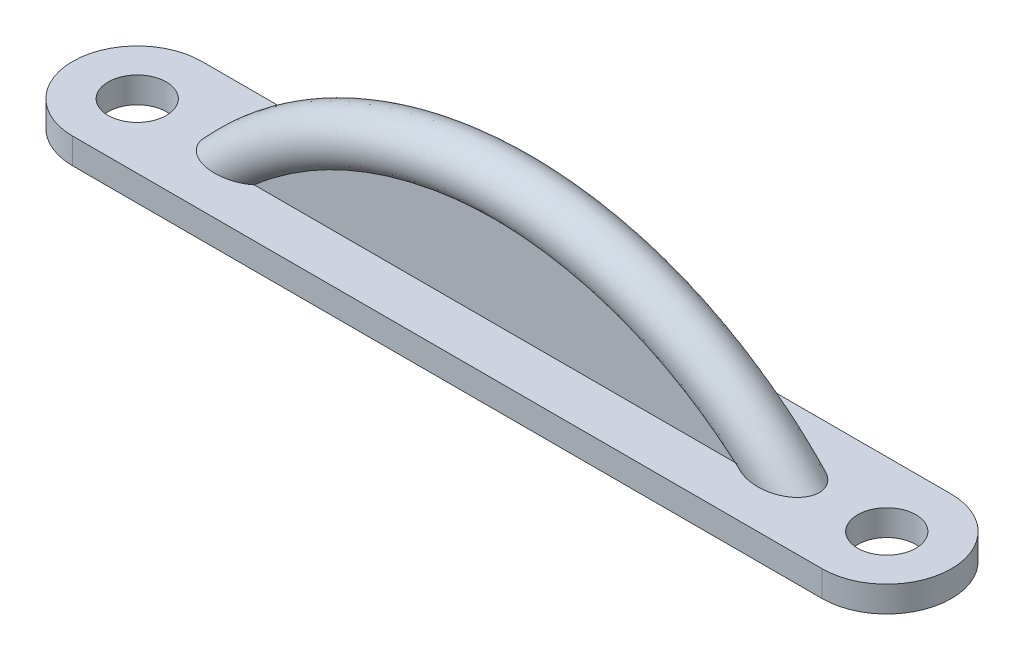
ISO-10303-21;
HEADER;
FILE_DESCRIPTION(('STEP AP214'),'2;1');
FILE_NAME('part.step','',(''),(''),'','','');
FILE_SCHEMA(('AUTOMOTIVE_DESIGN { 1 0 10303 214 1 1 1 1 }'));
ENDSEC;
DATA;
#1=APPLICATION_CONTEXT('core data for automotive mechanical design processes');
#2=APPLICATION_PROTOCOL_DEFINITION('international standard','automotive_design',2000,#1);
#3=PRODUCT_CONTEXT('',#1,'mechanical');
#4=PRODUCT('Part','Part','',(#3));
#5=PRODUCT_RELATED_PRODUCT_CATEGORY('part','',(#4));
#6=PRODUCT_DEFINITION_FORMATION('','',#4);
#7=PRODUCT_DEFINITION_CONTEXT('part definition',#1,'design');
#8=PRODUCT_DEFINITION('design','',#6,#7);
#9=PRODUCT_DEFINITION_SHAPE('','',#8);
#10=(LENGTH_UNIT() NAMED_UNIT(*) SI_UNIT(.MILLI.,.METRE.));
#11=(NAMED_UNIT(*) PLANE_ANGLE_UNIT() SI_UNIT($,.RADIAN.));
#12=(NAMED_UNIT(*) SI_UNIT($,.STERADIAN.) SOLID_ANGLE_UNIT());
#13=UNCERTAINTY_MEASURE_WITH_UNIT(LENGTH_MEASURE(1.E-05),#10,'distance_accuracy_value','');
#14=(GEOMETRIC_REPRESENTATION_CONTEXT(3) GLOBAL_UNCERTAINTY_ASSIGNED_CONTEXT((#13)) GLOBAL_UNIT_ASSIGNED_CONTEXT((#10,
#11,#12)) REPRESENTATION_CONTEXT('',''));
#15=CARTESIAN_POINT('',(0.,0.,0.));
#16=DIRECTION('',(0.,0.,1.));
#17=DIRECTION('',(1.,0.,0.));
#18=AXIS2_PLACEMENT_3D('',#15,#16,#17);
#19=CARTESIAN_POINT('',(-29.,2.,0.));
#20=DIRECTION('',(0.,1.,0.));
#21=DIRECTION('',(0.,0.,1.));
#22=AXIS2_PLACEMENT_3D('',#19,#20,#21);
#23=PLANE('',#22);
#24=CARTESIAN_POINT('',(-29.,2.,0.));
#25=DIRECTION('',(0.,1.,0.));
#26=DIRECTION('',(0.,0.,1.));
#27=AXIS2_PLACEMENT_3D('',#24,#25,#26);
#28=CIRCLE('',#27,2.25);
#29=CARTESIAN_POINT('',(-29.,2.,2.25));
#30=VERTEX_POINT('',#29);
#31=EDGE_CURVE('E285',#30,#30,#28,.T.);
#32=ORIENTED_EDGE('',*,*,#31,.F.);
#33=EDGE_LOOP('',(#32));
#34=FACE_BOUND('',#33,.T.);
#35=CARTESIAN_POINT('',(29.,2.,0.));
#36=DIRECTION('',(0.,1.,0.));
#37=DIRECTION('',(0.,0.,1.));
#38=AXIS2_PLACEMENT_3D('',#35,#36,#37);
#39=CIRCLE('',#38,2.25);
#40=CARTESIAN_POINT('',(29.,2.,2.25));
#41=VERTEX_POINT('',#40);
#42=EDGE_CURVE('E109',#41,#41,#39,.T.);
#43=ORIENTED_EDGE('',*,*,#42,.F.);
#44=EDGE_LOOP('',(#43));
#45=FACE_BOUND('',#44,.T.);
#46=CARTESIAN_POINT('',(18.0234534225179,2.00000000000277,0.));
#47=CARTESIAN_POINT('',(18.0234538199134,2.00000000000342,-0.0425345744357043));
#48=CARTESIAN_POINT('',(18.0255726664473,2.00000000000092,-0.0850784285935698));
#49=CARTESIAN_POINT('',(18.0339906258094,1.99999999999908,-0.169770793580517));
#50=CARTESIAN_POINT('',(18.0402924979108,1.99999999999975,-0.211919024818991));
#51=CARTESIAN_POINT('',(18.0569256716577,2.00000000000025,-0.295503517620379));
#52=CARTESIAN_POINT('',(18.0672653921568,2.00000000000007,-0.336938101538779));
#53=CARTESIAN_POINT('',(18.0917113728627,1.99999999999993,-0.418688955192903));
#54=CARTESIAN_POINT('',(18.1058196466542,1.99999999999998,-0.459004614323405));
#55=CARTESIAN_POINT('',(18.1530063055635,2.00000000000005,-0.577040430029253));
#56=CARTESIAN_POINT('',(18.1911430667857,2.00000000000001,-0.652780639690127));
#57=CARTESIAN_POINT('',(18.2782511712429,1.99999999999999,-0.797563509596352));
#58=CARTESIAN_POINT('',(18.3272237543727,2.,-0.866605402081661));
#59=CARTESIAN_POINT('',(18.4612958971004,2.00000000000001,-1.03191066501507));
#60=CARTESIAN_POINT('',(18.5519426221952,2.,-1.12367029072002));
#61=CARTESIAN_POINT('',(18.7465003988128,2.,-1.29194137668281));
#62=CARTESIAN_POINT('',(18.8504476639748,2.,-1.36840968926873));
#63=CARTESIAN_POINT('',(19.0387273677813,2.,-1.48881743004033));
#64=CARTESIAN_POINT('',(19.1210141621722,2.,-1.53601954595866));
#65=CARTESIAN_POINT('',(19.2893733434549,2.,-1.62314656458356));
#66=CARTESIAN_POINT('',(19.3754474682774,2.,-1.66306808221428));
#67=CARTESIAN_POINT('',(19.6379960210728,2.,-1.77243815298984));
#68=CARTESIAN_POINT('',(19.8188578762378,2.,-1.83152993013925));
#69=CARTESIAN_POINT('',(20.1932017543042,2.,-1.92518670469083));
#70=CARTESIAN_POINT('',(20.3869038432035,2.,-1.95884382487772));
#71=CARTESIAN_POINT('',(20.7773881986897,2.,-1.99860621352698));
#72=CARTESIAN_POINT('',(20.9741731909739,2.,-2.00468553840482));
#73=CARTESIAN_POINT('',(21.2860910339309,2.,-1.99155346967884));
#74=CARTESIAN_POINT('',(21.4016674073519,2.,-1.98167767553965));
#75=CARTESIAN_POINT('',(21.6314567483007,2.,-1.95155592896872));
#76=CARTESIAN_POINT('',(21.7456692507373,2.00000000000001,-1.93130653688359));
#77=CARTESIAN_POINT('',(22.0842626541814,1.99999999999999,-1.85433459676142));
#78=CARTESIAN_POINT('',(22.3054474382207,1.99999999999993,-1.78136027129505));
#79=CARTESIAN_POINT('',(22.6379071638108,1.99999999999997,-1.62796277123609));
#80=CARTESIAN_POINT('',(22.7565937829384,2.00000000000001,-1.56329771166025));
#81=CARTESIAN_POINT('',(22.9827617946772,1.99999999999999,-1.4165973984217));
#82=CARTESIAN_POINT('',(23.0902607022528,1.99999999999992,-1.33458992474679));
#83=CARTESIAN_POINT('',(23.2680573302236,1.99999999999996,-1.17183450653481));
#84=CARTESIAN_POINT('',(23.3414239460572,2.00000000000003,-1.09444962203087));
#85=CARTESIAN_POINT('',(23.4747243469283,1.99999999999997,-0.928808686808913));
#86=CARTESIAN_POINT('',(23.5346736726764,1.99999999999982,-0.840565398559824));
#87=CARTESIAN_POINT('',(23.6286931367383,1.99999999999986,-0.670337381196437));
#88=CARTESIAN_POINT('',(23.6654282246682,1.99999999999998,-0.589830433261606));
#89=CARTESIAN_POINT('',(23.7249674386916,2.00000000000002,-0.423796887658625));
#90=CARTESIAN_POINT('',(23.7477800836642,1.99999999999992,-0.338273394708835));
#91=CARTESIAN_POINT('',(23.7779673328133,1.9999999999999,-0.164144303664863));
#92=CARTESIAN_POINT('',(23.7852780856585,1.99999999999997,-0.0755274804102099));
#93=CARTESIAN_POINT('',(23.7836992808108,2.00000000000003,0.10156109306596));
#94=CARTESIAN_POINT('',(23.7748104972629,2.00000000000001,0.190032850017695));
#95=CARTESIAN_POINT('',(23.7426472671903,1.99999999999999,0.358143219232906));
#96=CARTESIAN_POINT('',(23.7203721591455,2.,0.437977349713582));
#97=CARTESIAN_POINT('',(23.66367999972,2.,0.593173729893854));
#98=CARTESIAN_POINT('',(23.6292608469502,2.,0.668535203012611));
#99=CARTESIAN_POINT('',(23.5469331921194,2.,0.819133588514863));
#100=CARTESIAN_POINT('',(23.4981865298646,2.,0.893908980652055));
#101=CARTESIAN_POINT('',(23.3908259572644,2.,1.03595902011016));
#102=CARTESIAN_POINT('',(23.3322059357408,2.,1.10322897876135));
#103=CARTESIAN_POINT('',(23.1735720734291,2.,1.2639167951135));
#104=CARTESIAN_POINT('',(23.0681953534476,2.,1.35206020117909));
#105=CARTESIAN_POINT('',(22.8446298735978,2.,1.51031305841495));
#106=CARTESIAN_POINT('',(22.7264103017644,2.,1.58037771472353));
#107=CARTESIAN_POINT('',(22.438408719279,2.,1.72495809186434));
#108=CARTESIAN_POINT('',(22.2650868682979,2.,1.79241292068604));
#109=CARTESIAN_POINT('',(21.9100821449645,2.,1.89861374792659));
#110=CARTESIAN_POINT('',(21.7283952095455,2.,1.93734563548875));
#111=CARTESIAN_POINT('',(21.3572490743215,2.,1.98881852581633));
#112=CARTESIAN_POINT('',(21.1677071026586,2.,2.00094747737747));
#113=CARTESIAN_POINT('',(20.7885388152836,2.,1.9989353352007));
#114=CARTESIAN_POINT('',(20.5989126669986,2.,1.98476300698581));
#115=CARTESIAN_POINT('',(20.2982958696304,2.,1.94145571689516));
#116=CARTESIAN_POINT('',(20.1860607294702,2.,1.92052624132336));
#117=CARTESIAN_POINT('',(19.9636950601378,2.,1.86923156783867));
#118=CARTESIAN_POINT('',(19.8535652935132,2.00000000000001,1.83886301742037));
#119=CARTESIAN_POINT('',(19.6366015603487,1.99999999999999,1.7684987406309));
#120=CARTESIAN_POINT('',(19.5297626570463,1.99999999999996,1.72851831528071));
#121=CARTESIAN_POINT('',(19.3204783172365,2.00000000000004,1.63849276505416));
#122=CARTESIAN_POINT('',(19.2180295546273,2.00000000000013,1.58845542921118));
#123=CARTESIAN_POINT('',(19.0071595582886,2.00000000000012,1.47104355371215));
#124=CARTESIAN_POINT('',(18.8994823366105,1.99999999999999,1.40231330184445));
#125=CARTESIAN_POINT('',(18.6949076605889,2.00000000000001,1.25033517629734));
#126=CARTESIAN_POINT('',(18.5979934960938,2.00000000000016,1.16711033713112));
#127=CARTESIAN_POINT('',(18.4406962094944,2.00000000000009,1.00638866409387));
#128=CARTESIAN_POINT('',(18.3770668597997,1.99999999999994,0.932091158487234));
#129=CARTESIAN_POINT('',(18.2622969059184,2.00000000000006,0.774305507604812));
#130=CARTESIAN_POINT('',(18.2111422773693,2.00000000000032,0.690827837564686));
#131=CARTESIAN_POINT('',(18.1341827219841,2.00000000000014,0.533921688363925));
#132=CARTESIAN_POINT('',(18.1053209862241,1.99999999999984,0.461997906170942));
#133=CARTESIAN_POINT('',(18.0599637341643,2.00000000000016,0.314425206498432));
#134=CARTESIAN_POINT('',(18.0434349275885,2.00000000000077,0.238786908908229));
#135=CARTESIAN_POINT('',(18.0303178008871,1.99999999999978,0.135455419222586));
#136=CARTESIAN_POINT('',(18.027748020089,1.99999999999936,0.108436381797406));
#137=CARTESIAN_POINT('',(18.0243155087062,2.00000000000064,0.0542795062745339));
#138=CARTESIAN_POINT('',(18.0234531689366,2.00000000000235,0.0271416424029775));
#139=CARTESIAN_POINT('',(18.0234534225179,2.00000000000277,0.));
#140=B_SPLINE_CURVE_WITH_KNOTS('',3,(#46,#47,#48,#49,#50,#51,#52,#53,#54,#55,#56,#57,#58,#59,
#60,#61,#62,#63,#64,#65,#66,#67,#68,#69,#70,#71,#72,#73,#74,#75,#76,#77,#78,#79,#80,#81,#82,#83,
#84,#85,#86,#87,#88,#89,#90,#91,#92,#93,#94,#95,#96,#97,#98,#99,#100,#101,#102,#103,#104,#105,
#106,#107,#108,#109,#110,#111,#112,#113,#114,#115,#116,#117,#118,#119,#120,#121,#122,#123,#124,
#125,#126,#127,#128,#129,#130,#131,#132,#133,#134,#135,#136,#137,#138,#139),.UNSPECIFIED.,.T.,
.F.,(4,2,2,2,2,2,2,2,2,2,2,2,2,2,2,2,2,2,2,2,2,2,2,2,2,2,2,2,2,2,2,2,2,2,2,2,2,2,2,2,2,2,2,2,2,
2,4),(0.,0.127567624481767,0.255219480863997,0.383138922799489,0.511126850873842,
0.764287783105275,1.01747769840513,1.40226947598606,1.78813216182818,2.07235450967611,
2.35670867017019,2.92520377319501,3.51314031908931,4.10162984691655,4.44917655235614,
4.79683857118095,5.48965210767889,5.89394283190812,6.29759078220387,6.61633858423133,
6.93471526047495,7.19908195722368,7.4632867303926,7.72857764946236,7.99385589111793,
8.24143548217484,8.48905793510012,8.75585490642479,9.02281762439544,9.43265916643228,
9.84350665328771,10.3984805780657,10.9537269672464,11.5216194640115,12.0901868015828,
12.4323472615216,12.7746293867864,13.1163702039186,13.4578473571822,13.840033639508,
14.2216180104772,14.5141115050392,14.8062746400255,15.0378654093194,15.26882876139,
15.3502120280427,15.4316139203107),.UNSPECIFIED.);
#141=CARTESIAN_POINT('',(18.6993506458462,2.,-1.25));
#142=VERTEX_POINT('',#141);
#143=CARTESIAN_POINT('',(18.6993506458465,2.,1.25));
#144=VERTEX_POINT('',#143);
#145=EDGE_CURVE('E61',#142,#144,#140,.T.);
#146=ORIENTED_EDGE('',*,*,#145,.T.);
#147=DIRECTION('',(1.,0.,0.));
#148=VECTOR('',#147,1.);
#149=CARTESIAN_POINT('',(-21.,2.,1.25));
#150=LINE('',#149,#148);
#151=CARTESIAN_POINT('',(-18.7011756852005,2.,1.25));
#152=VERTEX_POINT('',#151);
#153=EDGE_CURVE('E101',#152,#144,#150,.T.);
#154=ORIENTED_EDGE('',*,*,#153,.F.);
#155=CARTESIAN_POINT('',(-18.0277425041409,2.00000000000407,0.));
#156=CARTESIAN_POINT('',(-18.0277433267402,2.00000000000503,0.0426304807114197));
#157=CARTESIAN_POINT('',(-18.029867568113,2.00000000000138,0.0852718774203251));
#158=CARTESIAN_POINT('',(-18.0382968685185,1.99999999999862,0.170148620515763));
#159=CARTESIAN_POINT('',(-18.0446046892751,1.99999999999952,0.212383679968232));
#160=CARTESIAN_POINT('',(-18.0696189165222,2.00000000000096,0.338051665365508));
#161=CARTESIAN_POINT('',(-18.0944154887685,2.00000000000026,0.420335957496417));
#162=CARTESIAN_POINT('',(-18.1575554655815,1.99999999999975,0.578416179111028));
#163=CARTESIAN_POINT('',(-18.1957652108823,1.99999999999993,0.654267276338257));
#164=CARTESIAN_POINT('',(-18.2830403792727,2.00000000000007,0.799342034731207));
#165=CARTESIAN_POINT('',(-18.3321074270897,2.00000000000002,0.868564701770307));
#166=CARTESIAN_POINT('',(-18.4664940798311,1.99999999999997,1.03440733851958));
#167=CARTESIAN_POINT('',(-18.5573791366837,1.99999999999999,1.12650144761394));
#168=CARTESIAN_POINT('',(-18.7524730627675,2.00000000000001,1.29539972604479));
#169=CARTESIAN_POINT('',(-18.8567179157446,2.,1.37216111391577));
#170=CARTESIAN_POINT('',(-19.0449120845398,2.,1.49255898715114));
#171=CARTESIAN_POINT('',(-19.1267595463599,2.,1.53954739552426));
#172=CARTESIAN_POINT('',(-19.2942226035015,2.,1.626286277862));
#173=CARTESIAN_POINT('',(-19.3798398733656,2.,1.66603349419358));
#174=CARTESIAN_POINT('',(-19.6410034028457,2.,1.77489389267317));
#175=CARTESIAN_POINT('',(-19.8209335576226,2.,1.83367033384812));
#176=CARTESIAN_POINT('',(-20.1929920374768,2.,1.92654103855913));
#177=CARTESIAN_POINT('',(-20.3853265113177,2.,1.95978290783329));
#178=CARTESIAN_POINT('',(-20.7730221402183,2.,1.99884838398918));
#179=CARTESIAN_POINT('',(-20.9683859815674,2.,2.00464607326431));
#180=CARTESIAN_POINT('',(-21.2778689776049,2.,1.99138855182802));
#181=CARTESIAN_POINT('',(-21.3924364491539,2.,1.98155386764491));
#182=CARTESIAN_POINT('',(-21.6202390061627,2.,1.95173211339625));
#183=CARTESIAN_POINT('',(-21.733473651031,2.,1.93174177755982));
#184=CARTESIAN_POINT('',(-22.0692745939804,1.99999999999999,1.85592029707505));
#185=CARTESIAN_POINT('',(-22.2887299505465,1.99999999999995,1.78421142763586));
#186=CARTESIAN_POINT('',(-22.6208679362097,1.99999999999998,1.63288714582956));
#187=CARTESIAN_POINT('',(-22.7405862383429,2.00000000000002,1.56843104164335));
#188=CARTESIAN_POINT('',(-22.9688535216847,1.99999999999998,1.42201306445452));
#189=CARTESIAN_POINT('',(-23.0774201698161,1.99999999999992,1.34007953400892));
#190=CARTESIAN_POINT('',(-23.2568282480644,1.99999999999996,1.17753649401329));
#191=CARTESIAN_POINT('',(-23.3307779334852,2.00000000000003,1.10036872043215));
#192=CARTESIAN_POINT('',(-23.4652929374566,1.99999999999997,0.935078274680216));
#193=CARTESIAN_POINT('',(-23.5258738530281,1.99999999999982,0.846968557862327));
#194=CARTESIAN_POINT('',(-23.6209384776743,1.99999999999986,0.677080792381228));
#195=CARTESIAN_POINT('',(-23.6581180318881,1.99999999999998,0.5968173821485));
#196=CARTESIAN_POINT('',(-23.7185901969337,2.00000000000002,0.431195286648227));
#197=CARTESIAN_POINT('',(-23.7418913986298,1.99999999999992,0.34583978952208));
#198=CARTESIAN_POINT('',(-23.7730662989836,1.9999999999999,0.171942950659065));
#199=CARTESIAN_POINT('',(-23.7808740097531,1.99999999999997,0.0833896107970098));
#200=CARTESIAN_POINT('',(-23.7802481301029,2.00000000000003,-0.0936591727292396));
#201=CARTESIAN_POINT('',(-23.7718155784341,2.00000000000001,-0.182154619734182));
#202=CARTESIAN_POINT('',(-23.7405058405214,1.99999999999999,-0.350168648386967));
#203=CARTESIAN_POINT('',(-23.7186663770895,2.,-0.429885120973572));
#204=CARTESIAN_POINT('',(-23.6628370338867,2.,-0.584906057606654));
#205=CARTESIAN_POINT('',(-23.6288450758422,2.,-0.660209764433259));
#206=CARTESIAN_POINT('',(-23.5474596044956,2.,-0.810609079094444));
#207=CARTESIAN_POINT('',(-23.4992468816128,2.,-0.885258105981369));
#208=CARTESIAN_POINT('',(-23.3929661843915,2.,-1.02712973292367));
#209=CARTESIAN_POINT('',(-23.3348921653977,2.,-1.09434773602593));
#210=CARTESIAN_POINT('',(-23.1775101750125,2.,-1.25513854749218));
#211=CARTESIAN_POINT('',(-23.0728161715048,2.,-1.34345894301076));
#212=CARTESIAN_POINT('',(-22.8505861706031,2.,-1.50218450389608));
#213=CARTESIAN_POINT('',(-22.7330190883365,2.,-1.57254487404));
#214=CARTESIAN_POINT('',(-22.4459329907299,2.,-1.71827006853754));
#215=CARTESIAN_POINT('',(-22.2728063144918,2.,-1.78651741322059));
#216=CARTESIAN_POINT('',(-21.9180634284222,2.,-1.89435974466344));
#217=CARTESIAN_POINT('',(-21.7364426296607,2.,-1.93393904869822));
#218=CARTESIAN_POINT('',(-21.3651949089884,2.,-1.98717207417489));
#219=CARTESIAN_POINT('',(-21.1754800764043,2.,-2.00019835741731));
#220=CARTESIAN_POINT('',(-20.7958648576458,2.,-1.99979686715706));
#221=CARTESIAN_POINT('',(-20.6059644921285,2.,-1.98634053510521));
#222=CARTESIAN_POINT('',(-20.3054741259634,2.,-1.94398988240644));
#223=CARTESIAN_POINT('',(-20.1936419387735,2.,-1.92345900082803));
#224=CARTESIAN_POINT('',(-19.9720653200939,2.,-1.87293194694496));
#225=CARTESIAN_POINT('',(-19.8623216234371,2.00000000000001,-1.84293250611783));
#226=CARTESIAN_POINT('',(-19.6461050335743,1.99999999999999,-1.77328364323568));
#227=CARTESIAN_POINT('',(-19.5396275062811,1.99999999999997,-1.73364868025673));
#228=CARTESIAN_POINT('',(-19.3310413418796,2.00000000000003,-1.64432462216939));
#229=CARTESIAN_POINT('',(-19.2289294901987,2.00000000000012,-1.59464308466538));
#230=CARTESIAN_POINT('',(-19.0171709783794,2.00000000000011,-1.47719198297984));
#231=CARTESIAN_POINT('',(-18.9083634932048,1.99999999999999,-1.40788706160692));
#232=CARTESIAN_POINT('',(-18.7017145769267,2.00000000000001,-1.25449857465813));
#233=CARTESIAN_POINT('',(-18.60385591722,2.00000000000017,-1.17043877789447));
#234=CARTESIAN_POINT('',(-18.4456944323596,2.00000000000009,-1.00861589583199));
#235=CARTESIAN_POINT('',(-18.3820129578964,1.99999999999994,-0.93417653376944));
#236=CARTESIAN_POINT('',(-18.267117298885,2.00000000000006,-0.776130005112027));
#237=CARTESIAN_POINT('',(-18.2158888113149,2.00000000000034,-0.692533517731648));
#238=CARTESIAN_POINT('',(-18.138772468303,2.00000000000011,-0.535335852165517));
#239=CARTESIAN_POINT('',(-18.1098361720202,1.99999999999975,-0.46323596145992));
#240=CARTESIAN_POINT('',(-18.0643606762134,2.00000000000025,-0.315301245198184));
#241=CARTESIAN_POINT('',(-18.0477882030441,2.0000000000011,-0.239477033762297));
#242=CARTESIAN_POINT('',(-18.0346310654606,1.99999999999967,-0.135874169374633));
#243=CARTESIAN_POINT('',(-18.0320522857935,1.99999999999905,-0.108771635362323));
#244=CARTESIAN_POINT('',(-18.028607543815,2.00000000000095,-0.054447569112182));
#245=CARTESIAN_POINT('',(-18.0277419787868,2.00000000000345,-0.0272260107397705));
#246=CARTESIAN_POINT('',(-18.0277425041409,2.00000000000407,0.));
#247=B_SPLINE_CURVE_WITH_KNOTS('',3,(#155,#156,#157,#158,#159,#160,#161,#162,#163,#164,#165,
#166,#167,#168,#169,#170,#171,#172,#173,#174,#175,#176,#177,#178,#179,#180,#181,#182,#183,#184,
#185,#186,#187,#188,#189,#190,#191,#192,#193,#194,#195,#196,#197,#198,#199,#200,#201,#202,#203,
#204,#205,#206,#207,#208,#209,#210,#211,#212,#213,#214,#215,#216,#217,#218,#219,#220,#221,#222,
#223,#224,#225,#226,#227,#228,#229,#230,#231,#232,#233,#234,#235,#236,#237,#238,#239,#240,#241,
#242,#243,#244,#245,#246),.UNSPECIFIED.,.T.,.F.,(4,2,2,2,2,2,2,2,2,2,2,2,2,2,2,2,2,2,2,2,2,2,2,
2,2,2,2,2,2,2,2,2,2,2,2,2,2,2,2,2,2,2,2,2,2,4),(0.,0.127853439637583,0.255791363822138,
0.511995872056913,0.765716623298757,1.01947536796808,1.40549904368923,1.79258520504823,
2.07534979606767,2.35824128343098,2.92377289902849,3.50744878853766,4.0916757773386,
4.43621187661649,4.78085883917415,5.46780692830919,5.87451646533126,6.28057140222342,
6.60005795304018,6.91916977254221,7.18343367030706,7.44753381512689,7.71275638762963,
7.97796199667145,8.22485320094927,8.47178664783906,8.73739807655006,9.00317290809905,
9.41179256027598,9.82142163147926,10.3767138825845,10.9323096749099,11.5008885572018,
12.0700809244328,12.4108315825422,12.7516999957942,13.0920600250474,13.4321649622868,
13.8181056436392,14.2034302205704,14.4963551336965,14.7889419977992,15.0211027985215,
15.2526365293406,15.3342713628601,15.4159251247366),.UNSPECIFIED.);
#248=CARTESIAN_POINT('',(-18.7011756852007,2.,-1.25000000000019));
#249=VERTEX_POINT('',#248);
#250=EDGE_CURVE('E104',#152,#249,#247,.T.);
#251=ORIENTED_EDGE('',*,*,#250,.T.);
#252=DIRECTION('',(1.,0.,0.));
#253=VECTOR('',#252,1.);
#254=CARTESIAN_POINT('',(-21.,2.,-1.25));
#255=LINE('',#254,#253);
#256=EDGE_CURVE('E98',#249,#142,#255,.T.);
#257=ORIENTED_EDGE('',*,*,#256,.T.);
#258=EDGE_LOOP('',(#146,#154,#251,#257));
#259=FACE_BOUND('',#258,.T.);
#260=CARTESIAN_POINT('',(-29.,2.,0.));
#261=DIRECTION('',(0.,1.,0.));
#262=DIRECTION('',(0.,0.,1.));
#263=AXIS2_PLACEMENT_3D('',#260,#261,#262);
#264=CIRCLE('',#263,5.);
#265=CARTESIAN_POINT('',(-29.,2.,-5.));
#266=VERTEX_POINT('',#265);
#267=CARTESIAN_POINT('',(-29.,2.,5.));
#268=VERTEX_POINT('',#267);
#269=EDGE_CURVE('E191',#266,#268,#264,.T.);
#270=ORIENTED_EDGE('',*,*,#269,.T.);
#271=DIRECTION('',(1.,0.,0.));
#272=VECTOR('',#271,1.);
#273=CARTESIAN_POINT('',(-29.,2.,5.));
#274=LINE('',#273,#272);
#275=CARTESIAN_POINT('',(29.,2.,5.));
#276=VERTEX_POINT('',#275);
#277=EDGE_CURVE('E204',#268,#276,#274,.T.);
#278=ORIENTED_EDGE('',*,*,#277,.T.);
#279=CARTESIAN_POINT('',(29.,2.,0.));
#280=DIRECTION('',(0.,1.,0.));
#281=DIRECTION('',(0.,0.,1.));
#282=AXIS2_PLACEMENT_3D('',#279,#280,#281);
#283=CIRCLE('',#282,5.);
#284=CARTESIAN_POINT('',(29.,2.,-5.00000000000001));
#285=VERTEX_POINT('',#284);
#286=EDGE_CURVE('E185',#276,#285,#283,.T.);
#287=ORIENTED_EDGE('',*,*,#286,.T.);
#288=DIRECTION('',(-1.,0.,0.));
#289=VECTOR('',#288,1.);
#290=CARTESIAN_POINT('',(-29.,2.,-5.));
#291=LINE('',#290,#289);
#292=EDGE_CURVE('E198',#285,#266,#291,.T.);
#293=ORIENTED_EDGE('',*,*,#292,.T.);
#294=EDGE_LOOP('',(#270,#278,#287,#293));
#295=FACE_BOUND('',#294,.T.);
#296=ADVANCED_FACE('F40',(#34,#45,#259,#295),#23,.T.);
#297=CARTESIAN_POINT('',(-29.,2.,0.));
#298=DIRECTION('',(0.,-1.,0.));
#299=DIRECTION('',(0.,0.,-1.));
#300=AXIS2_PLACEMENT_3D('',#297,#298,#299);
#301=CYLINDRICAL_SURFACE('',#300,5.);
#302=CARTESIAN_POINT('',(-29.,0.,0.));
#303=DIRECTION('',(0.,1.,0.));
#304=DIRECTION('',(0.,0.,1.));
#305=AXIS2_PLACEMENT_3D('',#302,#303,#304);
#306=CIRCLE('',#305,5.);
#307=CARTESIAN_POINT('',(-29.,0.,-5.));
#308=VERTEX_POINT('',#307);
#309=CARTESIAN_POINT('',(-29.,0.,5.));
#310=VERTEX_POINT('',#309);
#311=EDGE_CURVE('E181',#308,#310,#306,.T.);
#312=ORIENTED_EDGE('',*,*,#311,.T.);
#313=DIRECTION('',(0.,-1.,0.));
#314=VECTOR('',#313,1.);
#315=CARTESIAN_POINT('',(-29.,2.,5.));
#316=LINE('',#315,#314);
#317=EDGE_CURVE('E54',#268,#310,#316,.T.);
#318=ORIENTED_EDGE('',*,*,#317,.F.);
#319=ORIENTED_EDGE('',*,*,#269,.F.);
#320=DIRECTION('',(0.,-1.,0.));
#321=VECTOR('',#320,1.);
#322=CARTESIAN_POINT('',(-29.,2.,-5.));
#323=LINE('',#322,#321);
#324=EDGE_CURVE('E195',#266,#308,#323,.T.);
#325=ORIENTED_EDGE('',*,*,#324,.T.);
#326=EDGE_LOOP('',(#312,#318,#319,#325));
#327=FACE_BOUND('',#326,.T.);
#328=ADVANCED_FACE('F42',(#327),#301,.T.);
#329=CARTESIAN_POINT('',(-29.,2.,5.));
#330=DIRECTION('',(0.,0.,-1.));
#331=DIRECTION('',(-1.,0.,0.));
#332=AXIS2_PLACEMENT_3D('',#329,#330,#331);
#333=PLANE('',#332);
#334=DIRECTION('',(1.,0.,0.));
#335=VECTOR('',#334,1.);
#336=CARTESIAN_POINT('',(-29.,0.,5.));
#337=LINE('',#336,#335);
#338=CARTESIAN_POINT('',(29.,0.,5.));
#339=VERTEX_POINT('',#338);
#340=EDGE_CURVE('E171',#310,#339,#337,.T.);
#341=ORIENTED_EDGE('',*,*,#340,.T.);
#342=DIRECTION('',(0.,-1.,0.));
#343=VECTOR('',#342,1.);
#344=CARTESIAN_POINT('',(29.,2.,5.));
#345=LINE('',#344,#343);
#346=EDGE_CURVE('E173',#276,#339,#345,.T.);
#347=ORIENTED_EDGE('',*,*,#346,.F.);
#348=ORIENTED_EDGE('',*,*,#277,.F.);
#349=ORIENTED_EDGE('',*,*,#317,.T.);
#350=EDGE_LOOP('',(#341,#347,#348,#349));
#351=FACE_BOUND('',#350,.T.);
#352=ADVANCED_FACE('F146',(#351),#333,.F.);
#353=CARTESIAN_POINT('',(29.,2.,0.));
#354=DIRECTION('',(0.,-1.,0.));
#355=DIRECTION('',(0.,0.,-1.));
#356=AXIS2_PLACEMENT_3D('',#353,#354,#355);
#357=CYLINDRICAL_SURFACE('',#356,5.);
#358=CARTESIAN_POINT('',(29.,0.,0.));
#359=DIRECTION('',(0.,1.,0.));
#360=DIRECTION('',(0.,0.,1.));
#361=AXIS2_PLACEMENT_3D('',#358,#359,#360);
#362=CIRCLE('',#361,5.);
#363=CARTESIAN_POINT('',(29.,0.,-5.00000000000001));
#364=VERTEX_POINT('',#363);
#365=EDGE_CURVE('E180',#339,#364,#362,.T.);
#366=ORIENTED_EDGE('',*,*,#365,.T.);
#367=DIRECTION('',(0.,-1.,0.));
#368=VECTOR('',#367,1.);
#369=CARTESIAN_POINT('',(29.,2.,-5.00000000000001));
#370=LINE('',#369,#368);
#371=EDGE_CURVE('E186',#285,#364,#370,.T.);
#372=ORIENTED_EDGE('',*,*,#371,.F.);
#373=ORIENTED_EDGE('',*,*,#286,.F.);
#374=ORIENTED_EDGE('',*,*,#346,.T.);
#375=EDGE_LOOP('',(#366,#372,#373,#374));
#376=FACE_BOUND('',#375,.T.);
#377=ADVANCED_FACE('F161',(#376),#357,.T.);
#378=CARTESIAN_POINT('',(-29.,2.,-5.));
#379=DIRECTION('',(0.,0.,1.));
#380=DIRECTION('',(1.,0.,0.));
#381=AXIS2_PLACEMENT_3D('',#378,#379,#380);
#382=PLANE('',#381);
#383=DIRECTION('',(-1.,0.,0.));
#384=VECTOR('',#383,1.);
#385=CARTESIAN_POINT('',(-29.,0.,-5.));
#386=LINE('',#385,#384);
#387=EDGE_CURVE('E189',#364,#308,#386,.T.);
#388=ORIENTED_EDGE('',*,*,#387,.T.);
#389=ORIENTED_EDGE('',*,*,#324,.F.);
#390=ORIENTED_EDGE('',*,*,#292,.F.);
#391=ORIENTED_EDGE('',*,*,#371,.T.);
#392=EDGE_LOOP('',(#388,#389,#390,#391));
#393=FACE_BOUND('',#392,.T.);
#394=ADVANCED_FACE('F157',(#393),#382,.F.);
#395=CARTESIAN_POINT('',(-29.,0.,0.));
#396=DIRECTION('',(0.,1.,0.));
#397=DIRECTION('',(0.,0.,1.));
#398=AXIS2_PLACEMENT_3D('',#395,#396,#397);
#399=PLANE('',#398);
#400=CARTESIAN_POINT('',(-29.,0.,0.));
#401=DIRECTION('',(0.,-1.,0.));
#402=DIRECTION('',(0.,0.,-1.));
#403=AXIS2_PLACEMENT_3D('',#400,#401,#402);
#404=CIRCLE('',#403,2.25);
#405=CARTESIAN_POINT('',(-29.,0.,-2.25));
#406=VERTEX_POINT('',#405);
#407=EDGE_CURVE('E281',#406,#406,#404,.T.);
#408=ORIENTED_EDGE('',*,*,#407,.F.);
#409=EDGE_LOOP('',(#408));
#410=FACE_BOUND('',#409,.T.);
#411=CARTESIAN_POINT('',(29.,0.,0.));
#412=DIRECTION('',(0.,-1.,0.));
#413=DIRECTION('',(0.,0.,-1.));
#414=AXIS2_PLACEMENT_3D('',#411,#412,#413);
#415=CIRCLE('',#414,2.25);
#416=CARTESIAN_POINT('',(29.,0.,-2.25));
#417=VERTEX_POINT('',#416);
#418=EDGE_CURVE('E112',#417,#417,#415,.T.);
#419=ORIENTED_EDGE('',*,*,#418,.F.);
#420=EDGE_LOOP('',(#419));
#421=FACE_BOUND('',#420,.T.);
#422=ORIENTED_EDGE('',*,*,#311,.F.);
#423=ORIENTED_EDGE('',*,*,#387,.F.);
#424=ORIENTED_EDGE('',*,*,#365,.F.);
#425=ORIENTED_EDGE('',*,*,#340,.F.);
#426=EDGE_LOOP('',(#422,#423,#424,#425));
#427=FACE_BOUND('',#426,.T.);
#428=ADVANCED_FACE('F153',(#410,#421,#427),#399,.F.);
#429=CARTESIAN_POINT('',(0.,-19.4242852856285,1.25));
#430=DIRECTION('',(0.,0.,-1.));
#431=DIRECTION('',(-1.,0.,0.));
#432=AXIS2_PLACEMENT_3D('',#429,#430,#431);
#433=PLANE('',#432);
#434=ORIENTED_EDGE('',*,*,#153,.T.);
#435=CARTESIAN_POINT('',(18.6993506458463,2.,1.25));
#436=CARTESIAN_POINT('',(18.4472470062989,2.2192704251941,1.25));
#437=CARTESIAN_POINT('',(18.1912685664582,2.4340359896724,1.25));
#438=CARTESIAN_POINT('',(17.671933701284,2.85443780150827,1.25));
#439=CARTESIAN_POINT('',(17.4085775038286,3.06007433033004,1.25));
#440=CARTESIAN_POINT('',(16.6079324346724,3.66316364515754,1.25));
#441=CARTESIAN_POINT('',(16.0601083151384,4.04676036622545,1.25));
#442=CARTESIAN_POINT('',(14.9178951025139,4.78931037066029,1.25));
#443=CARTESIAN_POINT('',(14.3225256817868,5.14675132162684,1.25));
#444=CARTESIAN_POINT('',(13.1075309286307,5.81786670736757,1.25));
#445=CARTESIAN_POINT('',(12.4879068313414,6.13154336708118,1.25));
#446=CARTESIAN_POINT('',(11.5424424710738,6.56722937780774,1.25));
#447=CARTESIAN_POINT('',(11.2245365631041,6.70668307616581,1.25));
#448=CARTESIAN_POINT('',(10.5837260223797,6.97362939658905,1.25));
#449=CARTESIAN_POINT('',(10.2608214644853,7.10112219758034,1.25));
#450=CARTESIAN_POINT('',(9.6103812226085,7.34368924471611,1.25));
#451=CARTESIAN_POINT('',(9.28284554733026,7.45876351419756,1.25));
#452=CARTESIAN_POINT('',(8.62368632402062,7.67649380584484,1.25));
#453=CARTESIAN_POINT('',(8.29206272035562,7.77914965879937,1.25));
#454=CARTESIAN_POINT('',(7.29203380588493,8.06860348498867,1.25));
#455=CARTESIAN_POINT('',(6.61821152355503,8.23698381880908,1.25));
#456=CARTESIAN_POINT('',(5.26024206869027,8.52482109496453,1.25));
#457=CARTESIAN_POINT('',(4.57609515482663,8.64427926088273,1.25));
#458=CARTESIAN_POINT('',(3.54500436629034,8.78660696243854,1.25));
#459=CARTESIAN_POINT('',(3.20051637969471,8.82790490835935,1.25));
#460=CARTESIAN_POINT('',(2.51027665908131,8.89814686637353,1.25));
#461=CARTESIAN_POINT('',(2.16452496027961,8.92709122011869,1.25));
#462=CARTESIAN_POINT('',(1.47205127907797,8.972526927482,1.25));
#463=CARTESIAN_POINT('',(1.1253289307814,8.98901268494241,1.25));
#464=CARTESIAN_POINT('',(0.431469070333943,9.00936448392554,1.25));
#465=CARTESIAN_POINT('',(0.0843315126105228,9.01322898242075,1.25));
#466=CARTESIAN_POINT('',(-0.61364819543809,9.00813361114785,1.25));
#467=CARTESIAN_POINT('',(-0.964489355174118,8.99903307270222,1.25));
#468=CARTESIAN_POINT('',(-1.66559644737015,8.96750558152318,1.25));
#469=CARTESIAN_POINT('',(-2.01586234339703,8.94507781507626,1.25));
#470=CARTESIAN_POINT('',(-2.7153860062043,8.88673101438331,1.25));
#471=CARTESIAN_POINT('',(-3.06464341040474,8.85080762030742,1.25));
#472=CARTESIAN_POINT('',(-3.7615331663871,8.76582589856458,1.25));
#473=CARTESIAN_POINT('',(-4.10916553252309,8.71676768714212,1.25));
#474=CARTESIAN_POINT('',(-5.14924795315682,8.55016788422672,1.25));
#475=CARTESIAN_POINT('',(-5.83868007288895,8.41321831766354,1.25));
#476=CARTESIAN_POINT('',(-7.20548707246882,8.08939670628894,1.25));
#477=CARTESIAN_POINT('',(-7.88286517655614,7.90253823202389,1.25));
#478=CARTESIAN_POINT('',(-8.9260466710863,7.57362816051057,1.25));
#479=CARTESIAN_POINT('',(-9.29719613538655,7.44829186439299,1.25));
#480=CARTESIAN_POINT('',(-10.0340604054495,7.18267724721086,1.25));
#481=CARTESIAN_POINT('',(-10.3997760500363,7.04240126029224,1.25));
#482=CARTESIAN_POINT('',(-11.124777320045,6.74717840894358,1.25));
#483=CARTESIAN_POINT('',(-11.4840695984823,6.59224791217101,1.25));
#484=CARTESIAN_POINT('',(-12.0179669785496,6.34880934133999,1.25));
#485=CARTESIAN_POINT('',(-12.1951044215902,6.26581668705805,1.25));
#486=CARTESIAN_POINT('',(-12.5476136671825,6.09615190022831,1.25));
#487=CARTESIAN_POINT('',(-12.7229854351401,6.00947969576179,1.25));
#488=CARTESIAN_POINT('',(-13.1578701864373,5.78880909644648,1.25));
#489=CARTESIAN_POINT('',(-13.4162394013091,5.65254510726999,1.25));
#490=CARTESIAN_POINT('',(-13.9284913229863,5.371847566254,1.25));
#491=CARTESIAN_POINT('',(-14.1823738630932,5.22741371170416,1.25));
#492=CARTESIAN_POINT('',(-14.9372522343295,4.78238474755161,1.25));
#493=CARTESIAN_POINT('',(-15.4314391659008,4.47008242516557,1.25));
#494=CARTESIAN_POINT('',(-16.1584522687954,3.97898358616091,1.25));
#495=CARTESIAN_POINT('',(-16.3988192523552,3.81119686191685,1.25));
#496=CARTESIAN_POINT('',(-16.8743186581645,3.46833193988074,1.25));
#497=CARTESIAN_POINT('',(-17.1094511255565,3.29325380500732,1.25));
#498=CARTESIAN_POINT('',(-17.4579744126271,3.02529915366192,1.25));
#499=CARTESIAN_POINT('',(-17.5734382757853,2.93510337206526,1.25));
#500=CARTESIAN_POINT('',(-17.8029560584767,2.75293321414311,1.25));
#501=CARTESIAN_POINT('',(-17.9170099888082,2.66095885145308,1.25));
#502=CARTESIAN_POINT('',(-18.087002491047,2.52166835578773,1.25));
#503=CARTESIAN_POINT('',(-18.1434863044204,2.47501581484158,1.25));
#504=CARTESIAN_POINT('',(-18.2560890510505,2.38127261336733,1.25));
#505=CARTESIAN_POINT('',(-18.3122079857497,2.33418195457298,1.25));
#506=CARTESIAN_POINT('',(-18.4240636478391,2.23954670369858,1.25));
#507=CARTESIAN_POINT('',(-18.4798003689708,2.19200210421586,1.25));
#508=CARTESIAN_POINT('',(-18.5908331691855,2.09640021684512,1.25));
#509=CARTESIAN_POINT('',(-18.6461292438755,2.048342923857,1.25));
#510=CARTESIAN_POINT('',(-18.7011756852005,2.,1.25));
#511=B_SPLINE_CURVE_WITH_KNOTS('',3,(#435,#436,#437,#438,#439,#440,#441,#442,#443,#444,#445,
#446,#447,#448,#449,#450,#451,#452,#453,#454,#455,#456,#457,#458,#459,#460,#461,#462,#463,#464,
#465,#466,#467,#468,#469,#470,#471,#472,#473,#474,#475,#476,#477,#478,#479,#480,#481,#482,#483,
#484,#485,#486,#487,#488,#489,#490,#491,#492,#493,#494,#495,#496,#497,#498,#499,#500,#501,#502,
#503,#504,#505,#506,#507,#508,#509,#510),.UNSPECIFIED.,.F.,.F.,(4,2,2,2,2,2,2,2,2,2,2,2,2,2,2,2,
2,2,2,2,2,2,2,2,2,2,2,2,2,2,2,2,2,2,2,2,2,4),(0.,1.00224289469103,2.004454866982,
4.00904224688725,6.09062015761494,8.17209220409667,9.21333792255417,10.2545680622657,
11.2957962452582,12.3370386142562,14.4186970418449,16.5003034022852,17.5409825252357,
18.5816328652269,19.6227503676132,20.6639951483338,21.7166236915875,22.7693165112292,
23.822349701391,24.8753735724091,26.9820317104169,29.0881176169139,30.2630595283346,
31.4378181378484,32.611279810872,33.1980901142523,33.7849118924284,34.6610464235728,
35.5372134385991,37.2896807318504,38.1689905438864,39.0482927698021,39.4878302032042,
39.9273642682373,40.1471395108108,40.3669138840444,40.5866918474043,40.8064719990785),.UNSPECIFIED.);
#512=EDGE_CURVE('E67',#144,#152,#511,.T.);
#513=ORIENTED_EDGE('',*,*,#512,.T.);
#514=EDGE_LOOP('',(#434,#513));
#515=FACE_BOUND('',#514,.T.);
#516=ADVANCED_FACE('F156',(#515),#433,.F.);
#517=CARTESIAN_POINT('',(0.,-19.4242852856285,-1.25));
#518=DIRECTION('',(0.,0.,-1.));
#519=DIRECTION('',(-1.,0.,0.));
#520=AXIS2_PLACEMENT_3D('',#517,#518,#519);
#521=PLANE('',#520);
#522=CARTESIAN_POINT('',(18.6993506458463,2.,-1.25));
#523=CARTESIAN_POINT('',(18.4472470062989,2.21927042519411,-1.25));
#524=CARTESIAN_POINT('',(18.1912685664582,2.43403598967241,-1.25));
#525=CARTESIAN_POINT('',(17.671933701284,2.85443780150827,-1.25));
#526=CARTESIAN_POINT('',(17.4085775038286,3.06007433033004,-1.25));
#527=CARTESIAN_POINT('',(16.6079324346724,3.66316364515754,-1.25));
#528=CARTESIAN_POINT('',(16.0601083151384,4.04676036622546,-1.25));
#529=CARTESIAN_POINT('',(14.9178951025139,4.78931037066029,-1.25));
#530=CARTESIAN_POINT('',(14.3225256817868,5.14675132162684,-1.25));
#531=CARTESIAN_POINT('',(13.1075309286307,5.81786670736757,-1.25));
#532=CARTESIAN_POINT('',(12.4879068313414,6.13154336708119,-1.25));
#533=CARTESIAN_POINT('',(11.5424424710738,6.56722937780774,-1.25));
#534=CARTESIAN_POINT('',(11.2245365631041,6.70668307616581,-1.25));
#535=CARTESIAN_POINT('',(10.5837260223797,6.97362939658905,-1.25));
#536=CARTESIAN_POINT('',(10.2608214644853,7.10112219758034,-1.25));
#537=CARTESIAN_POINT('',(9.61038122260849,7.34368924471612,-1.25));
#538=CARTESIAN_POINT('',(9.28284554733024,7.45876351419757,-1.25));
#539=CARTESIAN_POINT('',(8.6236863240206,7.67649380584484,-1.25));
#540=CARTESIAN_POINT('',(8.29206272035561,7.77914965879938,-1.25));
#541=CARTESIAN_POINT('',(7.29203380588492,8.06860348498867,-1.25));
#542=CARTESIAN_POINT('',(6.61821152355502,8.23698381880908,-1.25));
#543=CARTESIAN_POINT('',(5.26024206869026,8.52482109496453,-1.25));
#544=CARTESIAN_POINT('',(4.57609515482661,8.64427926088274,-1.25));
#545=CARTESIAN_POINT('',(3.54500436629032,8.78660696243854,-1.25));
#546=CARTESIAN_POINT('',(3.20051637969469,8.82790490835935,-1.25));
#547=CARTESIAN_POINT('',(2.51027665908129,8.89814686637353,-1.25));
#548=CARTESIAN_POINT('',(2.16452496027959,8.9270912201187,-1.25));
#549=CARTESIAN_POINT('',(1.47205127907795,8.972526927482,-1.25));
#550=CARTESIAN_POINT('',(1.12532893078138,8.98901268494241,-1.25));
#551=CARTESIAN_POINT('',(0.431469070333928,9.00936448392554,-1.25));
#552=CARTESIAN_POINT('',(0.0843315126105082,9.01322898242076,-1.25));
#553=CARTESIAN_POINT('',(-0.613648195438105,9.00813361114785,-1.25));
#554=CARTESIAN_POINT('',(-0.964489355174133,8.99903307270222,-1.25));
#555=CARTESIAN_POINT('',(-1.66559644737016,8.96750558152318,-1.25));
#556=CARTESIAN_POINT('',(-2.01586234339704,8.94507781507626,-1.25));
#557=CARTESIAN_POINT('',(-2.71538600620432,8.88673101438331,-1.25));
#558=CARTESIAN_POINT('',(-3.06464341040475,8.85080762030741,-1.25));
#559=CARTESIAN_POINT('',(-3.76153316638712,8.76582589856458,-1.25));
#560=CARTESIAN_POINT('',(-4.10916553252311,8.71676768714211,-1.25));
#561=CARTESIAN_POINT('',(-5.14924795315684,8.55016788422671,-1.25));
#562=CARTESIAN_POINT('',(-5.83868007288898,8.41321831766352,-1.25));
#563=CARTESIAN_POINT('',(-7.20548707246884,8.08939670628892,-1.25));
#564=CARTESIAN_POINT('',(-7.88286517655616,7.90253823202386,-1.25));
#565=CARTESIAN_POINT('',(-8.92604667108631,7.57362816051053,-1.25));
#566=CARTESIAN_POINT('',(-9.29719613538654,7.44829186439295,-1.25));
#567=CARTESIAN_POINT('',(-10.0340604054495,7.18267724721082,-1.25));
#568=CARTESIAN_POINT('',(-10.3997760500363,7.0424012602922,-1.25));
#569=CARTESIAN_POINT('',(-11.124777320045,6.74717840894356,-1.25));
#570=CARTESIAN_POINT('',(-11.4840695984822,6.59224791217099,-1.25));
#571=CARTESIAN_POINT('',(-12.0179669785495,6.34880934133999,-1.25));
#572=CARTESIAN_POINT('',(-12.1951044215902,6.26581668705805,-1.25));
#573=CARTESIAN_POINT('',(-12.5476136671824,6.09615190022831,-1.25));
#574=CARTESIAN_POINT('',(-12.72298543514,6.00947969576181,-1.25));
#575=CARTESIAN_POINT('',(-13.1578701864372,5.78880909644651,-1.25));
#576=CARTESIAN_POINT('',(-13.416239401309,5.65254510727002,-1.25));
#577=CARTESIAN_POINT('',(-13.9284913229863,5.37184756625405,-1.25));
#578=CARTESIAN_POINT('',(-14.1823738630932,5.22741371170421,-1.25));
#579=CARTESIAN_POINT('',(-14.9372522343294,4.78238474755167,-1.25));
#580=CARTESIAN_POINT('',(-15.4314391659008,4.47008242516563,-1.25));
#581=CARTESIAN_POINT('',(-16.1584522687954,3.97898358616096,-1.25));
#582=CARTESIAN_POINT('',(-16.3988192523552,3.8111968619169,-1.25));
#583=CARTESIAN_POINT('',(-16.8743186581645,3.46833193988077,-1.25));
#584=CARTESIAN_POINT('',(-17.1094511255565,3.29325380500734,-1.25));
#585=CARTESIAN_POINT('',(-17.4579744126271,3.02529915366194,-1.25));
#586=CARTESIAN_POINT('',(-17.5734382757853,2.93510337206528,-1.25));
#587=CARTESIAN_POINT('',(-17.8029560584767,2.75293321414313,-1.25));
#588=CARTESIAN_POINT('',(-17.9170099888082,2.66095885145309,-1.25));
#589=CARTESIAN_POINT('',(-18.087002491047,2.52166835578773,-1.25));
#590=CARTESIAN_POINT('',(-18.1434863044204,2.47501581484158,-1.25));
#591=CARTESIAN_POINT('',(-18.2560890510505,2.38127261336733,-1.25));
#592=CARTESIAN_POINT('',(-18.3122079857497,2.33418195457298,-1.25));
#593=CARTESIAN_POINT('',(-18.4240636478391,2.23954670369857,-1.25));
#594=CARTESIAN_POINT('',(-18.4798003689708,2.19200210421586,-1.25));
#595=CARTESIAN_POINT('',(-18.5908331691855,2.09640021684511,-1.25));
#596=CARTESIAN_POINT('',(-18.6461292438755,2.04834292385699,-1.25));
#597=CARTESIAN_POINT('',(-18.7011756852005,2.,-1.25));
#598=B_SPLINE_CURVE_WITH_KNOTS('',3,(#522,#523,#524,#525,#526,#527,#528,#529,#530,#531,#532,
#533,#534,#535,#536,#537,#538,#539,#540,#541,#542,#543,#544,#545,#546,#547,#548,#549,#550,#551,
#552,#553,#554,#555,#556,#557,#558,#559,#560,#561,#562,#563,#564,#565,#566,#567,#568,#569,#570,
#571,#572,#573,#574,#575,#576,#577,#578,#579,#580,#581,#582,#583,#584,#585,#586,#587,#588,#589,
#590,#591,#592,#593,#594,#595,#596,#597),.UNSPECIFIED.,.F.,.F.,(4,2,2,2,2,2,2,2,2,2,2,2,2,2,2,2,
2,2,2,2,2,2,2,2,2,2,2,2,2,2,2,2,2,2,2,2,2,4),(0.,1.00224289469103,2.004454866982,
4.00904224688725,6.09062015761494,8.17209220409668,9.21333792255418,10.2545680622657,
11.2957962452582,12.3370386142562,14.4186970418449,16.5003034022852,17.5409825252357,
18.5816328652269,19.6227503676132,20.6639951483338,21.7166236915875,22.7693165112293,
23.822349701391,24.8753735724091,26.9820317104169,29.088117616914,30.2630595283346,
31.4378181378484,32.611279810872,33.1980901142522,33.7849118924283,34.6610464235728,
35.5372134385991,37.2896807318503,38.1689905438864,39.0482927698021,39.4878302032042,
39.9273642682373,40.1471395108108,40.3669138840444,40.5866918474043,40.8064719990785),.UNSPECIFIED.);
#599=EDGE_CURVE('E12',#142,#249,#598,.T.);
#600=ORIENTED_EDGE('',*,*,#599,.F.);
#601=ORIENTED_EDGE('',*,*,#256,.F.);
#602=EDGE_LOOP('',(#600,#601));
#603=FACE_BOUND('',#602,.T.);
#604=ADVANCED_FACE('F100',(#603),#521,.T.);
#605=CARTESIAN_POINT('',(21.885020958494,-1.84028452976812,0.));
#606=CARTESIAN_POINT('',(21.1204538046925,-1.00803707952276,0.));
#607=CARTESIAN_POINT('',(20.3344081245938,-0.148150221654895,0.));
#608=CARTESIAN_POINT('',(16.9225390166488,3.19615315660472,0.));
#609=CARTESIAN_POINT('',(13.5066063876996,5.43375293366892,0.));
#610=CARTESIAN_POINT('',(5.92176490138816,8.23946615473189,0.));
#611=CARTESIAN_POINT('',(1.71237311306755,8.8156427468205,0.));
#612=CARTESIAN_POINT('',(-6.36534343552471,8.14214713642911,0.));
#613=CARTESIAN_POINT('',(-10.2648162643754,6.9010783688679,0.));
#614=CARTESIAN_POINT('',(-15.2408835769801,4.14080146803692,0.));
#615=CARTESIAN_POINT('',(-16.7796426132416,3.0618217238774,0.));
#616=CARTESIAN_POINT('',(-19.4971780830734,0.750975242339086,0.));
#617=CARTESIAN_POINT('',(-20.6942296674159,-0.544083130217245,0.));
#618=CARTESIAN_POINT('',(-21.9079380015482,-1.86523021363739,0.));
#619=CARTESIAN_POINT('',(21.885020958494,-1.84028452976812,4.));
#620=CARTESIAN_POINT('',(21.1204538046925,-1.00803707952276,4.));
#621=CARTESIAN_POINT('',(20.3344081245938,-0.148150221654895,4.));
#622=CARTESIAN_POINT('',(16.9225390166488,3.19615315660472,4.));
#623=CARTESIAN_POINT('',(13.5066063876996,5.43375293366892,4.));
#624=CARTESIAN_POINT('',(5.92176490138816,8.23946615473189,4.));
#625=CARTESIAN_POINT('',(1.71237311306755,8.8156427468205,4.));
#626=CARTESIAN_POINT('',(-6.36534343552471,8.14214713642911,4.));
#627=CARTESIAN_POINT('',(-10.2648162643754,6.9010783688679,4.));
#628=CARTESIAN_POINT('',(-15.2408835769801,4.14080146803692,4.));
#629=CARTESIAN_POINT('',(-16.7796426132416,3.0618217238774,4.));
#630=CARTESIAN_POINT('',(-19.4971780830734,0.750975242339086,4.));
#631=CARTESIAN_POINT('',(-20.6942296674159,-0.544083130217245,4.));
#632=CARTESIAN_POINT('',(-21.9079380015482,-1.86523021363739,4.));
#633=CARTESIAN_POINT('',(24.8306850501061,0.865831332383217,4.));
#634=CARTESIAN_POINT('',(24.0729361026132,1.69065702134667,4.));
#635=CARTESIAN_POINT('',(23.2466192778452,2.59843202593389,4.));
#636=CARTESIAN_POINT('',(19.3134463409739,6.45371626242876,4.));
#637=CARTESIAN_POINT('',(15.4564591226334,8.97737824081634,4.));
#638=CARTESIAN_POINT('',(6.74739377918104,12.1989536561071,4.));
#639=CARTESIAN_POINT('',(1.97850867157021,12.8517116316136,4.));
#640=CARTESIAN_POINT('',(-7.29618904009278,12.0784154594227,4.));
#641=CARTESIAN_POINT('',(-11.7204727305607,10.6678052622398,4.));
#642=CARTESIAN_POINT('',(-17.4235255880544,7.50426210433863,4.));
#643=CARTESIAN_POINT('',(-19.1532454181174,6.29409722319827,4.));
#644=CARTESIAN_POINT('',(-22.3059782348141,3.61318081980011,4.));
#645=CARTESIAN_POINT('',(-23.636906042864,2.16528492394624,4.));
#646=CARTESIAN_POINT('',(-24.8536020931604,0.840885648513888,4.));
#647=CARTESIAN_POINT('',(24.8306850501061,0.865831332383217,0.));
#648=CARTESIAN_POINT('',(24.0729361026132,1.69065702134667,0.));
#649=CARTESIAN_POINT('',(23.2466192778452,2.59843202593389,0.));
#650=CARTESIAN_POINT('',(19.3134463409739,6.45371626242876,0.));
#651=CARTESIAN_POINT('',(15.4564591226334,8.97737824081634,0.));
#652=CARTESIAN_POINT('',(6.74739377918104,12.1989536561071,0.));
#653=CARTESIAN_POINT('',(1.97850867157021,12.8517116316136,0.));
#654=CARTESIAN_POINT('',(-7.29618904009278,12.0784154594227,0.));
#655=CARTESIAN_POINT('',(-11.7204727305589,10.6678052622398,0.));
#656=CARTESIAN_POINT('',(-17.4235255880553,7.50426210433863,0.));
#657=CARTESIAN_POINT('',(-19.1532454181174,6.29409722319827,0.));
#658=CARTESIAN_POINT('',(-22.3059782348141,3.61318081980011,0.));
#659=CARTESIAN_POINT('',(-23.636906042864,2.16528492394624,0.));
#660=CARTESIAN_POINT('',(-24.8536020931604,0.840885648513888,0.));
#661=CARTESIAN_POINT('',(24.8306850501061,0.865831332383217,-4.));
#662=CARTESIAN_POINT('',(24.0729361026132,1.69065702134667,-4.));
#663=CARTESIAN_POINT('',(23.2466192778452,2.59843202593389,-4.));
#664=CARTESIAN_POINT('',(19.3134463409739,6.45371626242876,-4.));
#665=CARTESIAN_POINT('',(15.4564591226334,8.97737824081634,-4.));
#666=CARTESIAN_POINT('',(6.74739377918104,12.1989536561071,-4.));
#667=CARTESIAN_POINT('',(1.97850867157021,12.8517116316136,-4.));
#668=CARTESIAN_POINT('',(-7.29618904009278,12.0784154594227,-4.));
#669=CARTESIAN_POINT('',(-11.7204727305572,10.6678052622397,-4.));
#670=CARTESIAN_POINT('',(-17.4235255880561,7.50426210433863,-4.));
#671=CARTESIAN_POINT('',(-19.1532454181174,6.29409722319827,-4.));
#672=CARTESIAN_POINT('',(-22.3059782348141,3.61318081980011,-4.));
#673=CARTESIAN_POINT('',(-23.636906042864,2.16528492394624,-4.));
#674=CARTESIAN_POINT('',(-24.8536020931604,0.840885648513888,-4.));
#675=CARTESIAN_POINT('',(21.885020958494,-1.84028452976812,-4.));
#676=CARTESIAN_POINT('',(21.1204538046925,-1.00803707952276,-4.));
#677=CARTESIAN_POINT('',(20.3344081245938,-0.148150221654895,-4.));
#678=CARTESIAN_POINT('',(16.9225390166488,3.19615315660472,-4.));
#679=CARTESIAN_POINT('',(13.5066063876996,5.43375293366892,-4.));
#680=CARTESIAN_POINT('',(5.92176490138816,8.23946615473189,-4.));
#681=CARTESIAN_POINT('',(1.71237311306755,8.8156427468205,-4.));
#682=CARTESIAN_POINT('',(-6.36534343552471,8.14214713642911,-4.));
#683=CARTESIAN_POINT('',(-10.2648162643754,6.9010783688679,-4.));
#684=CARTESIAN_POINT('',(-15.2408835769801,4.14080146803692,-4.));
#685=CARTESIAN_POINT('',(-16.7796426132416,3.0618217238774,-4.));
#686=CARTESIAN_POINT('',(-19.4971780830734,0.750975242339086,-4.));
#687=CARTESIAN_POINT('',(-20.6942296674159,-0.544083130217245,-4.));
#688=CARTESIAN_POINT('',(-21.9079380015482,-1.86523021363739,-4.));
#689=CARTESIAN_POINT('',(21.885020958494,-1.84028452976812,0.));
#690=CARTESIAN_POINT('',(21.1204538046925,-1.00803707952276,0.));
#691=CARTESIAN_POINT('',(20.3344081245938,-0.148150221654895,0.));
#692=CARTESIAN_POINT('',(16.9225390166488,3.19615315660472,0.));
#693=CARTESIAN_POINT('',(13.5066063876996,5.43375293366892,0.));
#694=CARTESIAN_POINT('',(5.92176490138816,8.23946615473189,0.));
#695=CARTESIAN_POINT('',(1.71237311306755,8.8156427468205,0.));
#696=CARTESIAN_POINT('',(-6.36534343552471,8.14214713642911,0.));
#697=CARTESIAN_POINT('',(-10.2648162643754,6.9010783688679,0.));
#698=CARTESIAN_POINT('',(-15.2408835769801,4.14080146803692,0.));
#699=CARTESIAN_POINT('',(-16.7796426132416,3.0618217238774,0.));
#700=CARTESIAN_POINT('',(-19.4971780830734,0.750975242339086,0.));
#701=CARTESIAN_POINT('',(-20.6942296674159,-0.544083130217245,0.));
#702=CARTESIAN_POINT('',(-21.9079380015482,-1.86523021363739,0.));
#703=(BOUNDED_SURFACE() B_SPLINE_SURFACE(3,3,((#605,#606,#607,#608,#609,#610,#611,#612,#613,
#614,#615,#616,#617,#618),(#619,#620,#621,#622,#623,#624,#625,#626,#627,#628,#629,#630,#631,
#632),(#633,#634,#635,#636,#637,#638,#639,#640,#641,#642,#643,#644,#645,#646),(#647,#648,#649,
#650,#651,#652,#653,#654,#655,#656,#657,#658,#659,#660),(#661,#662,#663,#664,#665,#666,#667,
#668,#669,#670,#671,#672,#673,#674),(#675,#676,#677,#678,#679,#680,#681,#682,#683,#684,#685,
#686,#687,#688),(#689,#690,#691,#692,#693,#694,#695,#696,#697,#698,#699,#700,#701,#702)),
.UNSPECIFIED.,.T.,.F.,.F.) B_SPLINE_SURFACE_WITH_KNOTS((4,3,4),(4,2,2,2,2,2,4),(0.,0.5,1.),(0.,
0.0641726624747434,0.298129496856058,0.532086331237372,0.766043165618686,0.883021582809343,1.),
.UNSPECIFIED.) GEOMETRIC_REPRESENTATION_ITEM() RATIONAL_B_SPLINE_SURFACE(((1.,1.,1.,1.,1.,1.,1.,
1.,1.,1.,1.,1.,1.,1.),(0.333333333333333,0.333333333333333,0.333333333333333,0.333333333333333,
0.333333333333333,0.333333333333333,0.333333333333333,0.333333333333333,0.333333333333333,
0.333333333333333,0.333333333333333,0.333333333333333,0.333333333333333,0.333333333333333),
(0.333333333333333,0.333333333333333,0.333333333333333,0.333333333333333,0.333333333333333,
0.333333333333333,0.333333333333333,0.333333333333333,0.333333333333333,0.333333333333333,
0.333333333333333,0.333333333333333,0.333333333333333,0.333333333333333),(1.,1.,1.,1.,1.,1.,1.,
1.,1.,1.,1.,1.,1.,1.),(0.333333333333333,0.333333333333333,0.333333333333333,0.333333333333333,
0.333333333333333,0.333333333333333,0.333333333333333,0.333333333333333,0.333333333333333,
0.333333333333333,0.333333333333333,0.333333333333333,0.333333333333333,0.333333333333333),
(0.333333333333333,0.333333333333333,0.333333333333333,0.333333333333333,0.333333333333333,
0.333333333333333,0.333333333333333,0.333333333333333,0.333333333333333,0.333333333333333,
0.333333333333333,0.333333333333333,0.333333333333333,0.333333333333333),(1.,1.,1.,1.,1.,1.,1.,
1.,1.,1.,1.,1.,1.,1.))) REPRESENTATION_ITEM('') SURFACE());
#704=ORIENTED_EDGE('',*,*,#512,.F.);
#705=ORIENTED_EDGE('',*,*,#145,.F.);
#706=ORIENTED_EDGE('',*,*,#599,.T.);
#707=ORIENTED_EDGE('',*,*,#250,.F.);
#708=EDGE_LOOP('',(#704,#705,#706,#707));
#709=FACE_BOUND('',#708,.T.);
#710=ADVANCED_FACE('F108',(#709),#703,.T.);
#711=CARTESIAN_POINT('',(29.,0.,0.));
#712=DIRECTION('',(0.,-1.,0.));
#713=DIRECTION('',(0.,0.,-1.));
#714=AXIS2_PLACEMENT_3D('',#711,#712,#713);
#715=CYLINDRICAL_SURFACE('',#714,2.25);
#716=ORIENTED_EDGE('',*,*,#42,.T.);
#717=EDGE_LOOP('',(#716));
#718=FACE_BOUND('',#717,.T.);
#719=ORIENTED_EDGE('',*,*,#418,.T.);
#720=EDGE_LOOP('',(#719));
#721=FACE_BOUND('',#720,.T.);
#722=ADVANCED_FACE('F129',(#718,#721),#715,.F.);
#723=CARTESIAN_POINT('',(-29.,0.,0.));
#724=DIRECTION('',(0.,-1.,0.));
#725=DIRECTION('',(0.,0.,-1.));
#726=AXIS2_PLACEMENT_3D('',#723,#724,#725);
#727=CYLINDRICAL_SURFACE('',#726,2.25);
#728=ORIENTED_EDGE('',*,*,#31,.T.);
#729=EDGE_LOOP('',(#728));
#730=FACE_BOUND('',#729,.T.);
#731=ORIENTED_EDGE('',*,*,#407,.T.);
#732=EDGE_LOOP('',(#731));
#733=FACE_BOUND('',#732,.T.);
#734=ADVANCED_FACE('F132',(#730,#733),#727,.F.);
#735=CLOSED_SHELL('',(#296,#328,#352,#377,#394,#428,#516,#604,#710,#722,#734));
#736=MANIFOLD_SOLID_BREP('B2',#735);
#737=ADVANCED_BREP_SHAPE_REPRESENTATION('',(#18,#736),#14);
#738=SHAPE_DEFINITION_REPRESENTATION(#9,#737);
ENDSEC;
END-ISO-10303-21;
